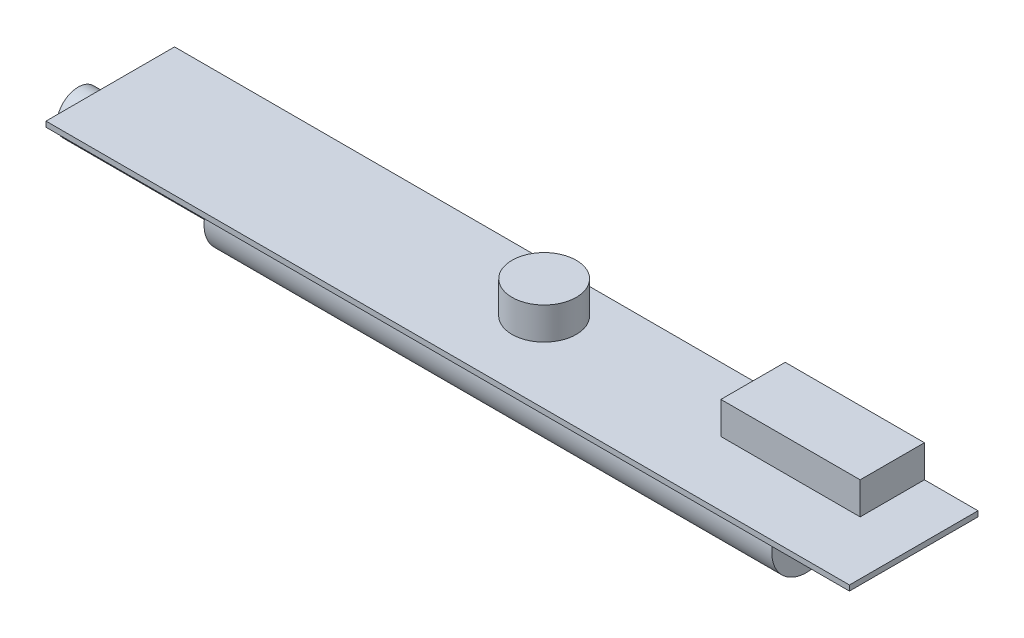
ISO-10303-21;
HEADER;
FILE_DESCRIPTION(('STEP AP214'),'2;1');
FILE_NAME('part.step','',(''),(''),'','','');
FILE_SCHEMA(('AUTOMOTIVE_DESIGN { 1 0 10303 214 1 1 1 1 }'));
ENDSEC;
DATA;
#1=APPLICATION_CONTEXT('core data for automotive mechanical design processes');
#2=APPLICATION_PROTOCOL_DEFINITION('international standard','automotive_design',2000,#1);
#3=PRODUCT_CONTEXT('',#1,'mechanical');
#4=PRODUCT('Part','Part','',(#3));
#5=PRODUCT_RELATED_PRODUCT_CATEGORY('part','',(#4));
#6=PRODUCT_DEFINITION_FORMATION('','',#4);
#7=PRODUCT_DEFINITION_CONTEXT('part definition',#1,'design');
#8=PRODUCT_DEFINITION('design','',#6,#7);
#9=PRODUCT_DEFINITION_SHAPE('','',#8);
#10=(LENGTH_UNIT() NAMED_UNIT(*) SI_UNIT(.MILLI.,.METRE.));
#11=(NAMED_UNIT(*) PLANE_ANGLE_UNIT() SI_UNIT($,.RADIAN.));
#12=(NAMED_UNIT(*) SI_UNIT($,.STERADIAN.) SOLID_ANGLE_UNIT());
#13=UNCERTAINTY_MEASURE_WITH_UNIT(LENGTH_MEASURE(1.E-05),#10,'distance_accuracy_value','');
#14=(GEOMETRIC_REPRESENTATION_CONTEXT(3) GLOBAL_UNCERTAINTY_ASSIGNED_CONTEXT((#13)) GLOBAL_UNIT_ASSIGNED_CONTEXT((#10,
#11,#12)) REPRESENTATION_CONTEXT('',''));
#15=CARTESIAN_POINT('',(0.,0.,0.));
#16=DIRECTION('',(0.,0.,1.));
#17=DIRECTION('',(1.,0.,0.));
#18=AXIS2_PLACEMENT_3D('',#15,#16,#17);
#19=CARTESIAN_POINT('',(-25.5,-3.25,0.));
#20=DIRECTION('',(1.,0.,0.));
#21=DIRECTION('',(0.,0.,-1.));
#22=AXIS2_PLACEMENT_3D('',#19,#20,#21);
#23=CYLINDRICAL_SURFACE('',#22,3.25);
#24=CARTESIAN_POINT('',(-25.5,-3.25,0.));
#25=DIRECTION('',(1.,0.,0.));
#26=DIRECTION('',(0.,0.,-1.));
#27=AXIS2_PLACEMENT_3D('',#24,#25,#26);
#28=CIRCLE('',#27,3.25);
#29=CARTESIAN_POINT('',(-25.5,-3.25,-3.25));
#30=VERTEX_POINT('',#29);
#31=EDGE_CURVE('E52',#30,#30,#28,.T.);
#32=ORIENTED_EDGE('',*,*,#31,.T.);
#33=EDGE_LOOP('',(#32));
#34=FACE_BOUND('',#33,.T.);
#35=CARTESIAN_POINT('',(27.5,-3.25,0.));
#36=DIRECTION('',(1.,0.,0.));
#37=DIRECTION('',(0.,0.,-1.));
#38=AXIS2_PLACEMENT_3D('',#35,#36,#37);
#39=CIRCLE('',#38,3.25);
#40=CARTESIAN_POINT('',(27.5,-3.25,-3.25));
#41=VERTEX_POINT('',#40);
#42=EDGE_CURVE('E48',#41,#41,#39,.T.);
#43=ORIENTED_EDGE('',*,*,#42,.F.);
#44=EDGE_LOOP('',(#43));
#45=FACE_BOUND('',#44,.T.);
#46=ADVANCED_FACE('F45',(#34,#45),#23,.T.);
#47=CARTESIAN_POINT('',(-25.5,-3.25,0.));
#48=DIRECTION('',(1.,0.,0.));
#49=DIRECTION('',(0.,0.,-1.));
#50=AXIS2_PLACEMENT_3D('',#47,#48,#49);
#51=PLANE('',#50);
#52=CARTESIAN_POINT('',(-25.5,-3.25,0.));
#53=DIRECTION('',(-1.,0.,0.));
#54=DIRECTION('',(0.,0.,1.));
#55=AXIS2_PLACEMENT_3D('',#52,#53,#54);
#56=CIRCLE('',#55,2.);
#57=CARTESIAN_POINT('',(-25.5,-3.25,2.));
#58=VERTEX_POINT('',#57);
#59=EDGE_CURVE('E11',#58,#58,#56,.T.);
#60=ORIENTED_EDGE('',*,*,#59,.F.);
#61=EDGE_LOOP('',(#60));
#62=FACE_BOUND('',#61,.T.);
#63=ORIENTED_EDGE('',*,*,#31,.F.);
#64=EDGE_LOOP('',(#63));
#65=FACE_BOUND('',#64,.T.);
#66=ADVANCED_FACE('F68',(#62,#65),#51,.F.);
#67=CARTESIAN_POINT('',(27.5,-3.25,0.));
#68=DIRECTION('',(1.,0.,0.));
#69=DIRECTION('',(0.,0.,-1.));
#70=AXIS2_PLACEMENT_3D('',#67,#68,#69);
#71=PLANE('',#70);
#72=ORIENTED_EDGE('',*,*,#42,.T.);
#73=EDGE_LOOP('',(#72));
#74=FACE_BOUND('',#73,.T.);
#75=ADVANCED_FACE('F65',(#74),#71,.T.);
#76=CARTESIAN_POINT('',(-40.5,-3.25,0.));
#77=DIRECTION('',(1.,0.,0.));
#78=DIRECTION('',(0.,0.,-1.));
#79=AXIS2_PLACEMENT_3D('',#76,#77,#78);
#80=CYLINDRICAL_SURFACE('',#79,2.);
#81=CARTESIAN_POINT('',(-40.5,-3.25,0.));
#82=DIRECTION('',(-1.,0.,0.));
#83=DIRECTION('',(0.,0.,1.));
#84=AXIS2_PLACEMENT_3D('',#81,#82,#83);
#85=CIRCLE('',#84,2.);
#86=CARTESIAN_POINT('',(-40.5,-3.25,2.));
#87=VERTEX_POINT('',#86);
#88=EDGE_CURVE('E58',#87,#87,#85,.T.);
#89=ORIENTED_EDGE('',*,*,#88,.F.);
#90=EDGE_LOOP('',(#89));
#91=FACE_BOUND('',#90,.T.);
#92=ORIENTED_EDGE('',*,*,#59,.T.);
#93=EDGE_LOOP('',(#92));
#94=FACE_BOUND('',#93,.T.);
#95=ADVANCED_FACE('F80',(#91,#94),#80,.T.);
#96=CARTESIAN_POINT('',(-40.5,-3.25,0.));
#97=DIRECTION('',(-1.,0.,0.));
#98=DIRECTION('',(0.,0.,1.));
#99=AXIS2_PLACEMENT_3D('',#96,#97,#98);
#100=PLANE('',#99);
#101=ORIENTED_EDGE('',*,*,#88,.T.);
#102=EDGE_LOOP('',(#101));
#103=FACE_BOUND('',#102,.T.);
#104=ADVANCED_FACE('F84',(#103),#100,.T.);
#105=CLOSED_SHELL('',(#46,#66,#75,#95,#104));
#106=MANIFOLD_SOLID_BREP('B2',#105);
#107=CARTESIAN_POINT('',(19.5,3.5,-6.));
#108=DIRECTION('',(1.,0.,0.));
#109=DIRECTION('',(0.,0.,-1.));
#110=AXIS2_PLACEMENT_3D('',#107,#108,#109);
#111=PLANE('',#110);
#112=DIRECTION('',(0.,0.,1.));
#113=VECTOR('',#112,1.);
#114=CARTESIAN_POINT('',(19.5,0.5,-6.));
#115=LINE('',#114,#113);
#116=CARTESIAN_POINT('',(19.5,0.5,-6.));
#117=VERTEX_POINT('',#116);
#118=CARTESIAN_POINT('',(19.5,0.5,0.));
#119=VERTEX_POINT('',#118);
#120=EDGE_CURVE('E186',#117,#119,#115,.T.);
#121=ORIENTED_EDGE('',*,*,#120,.T.);
#122=DIRECTION('',(0.,-1.,0.));
#123=VECTOR('',#122,1.);
#124=CARTESIAN_POINT('',(19.5,3.5,0.));
#125=LINE('',#124,#123);
#126=CARTESIAN_POINT('',(19.5,3.5,0.));
#127=VERTEX_POINT('',#126);
#128=EDGE_CURVE('E43',#127,#119,#125,.T.);
#129=ORIENTED_EDGE('',*,*,#128,.F.);
#130=DIRECTION('',(0.,0.,1.));
#131=VECTOR('',#130,1.);
#132=CARTESIAN_POINT('',(19.5,3.5,-6.));
#133=LINE('',#132,#131);
#134=CARTESIAN_POINT('',(19.5,3.5,-6.));
#135=VERTEX_POINT('',#134);
#136=EDGE_CURVE('E174',#135,#127,#133,.T.);
#137=ORIENTED_EDGE('',*,*,#136,.F.);
#138=DIRECTION('',(0.,-1.,0.));
#139=VECTOR('',#138,1.);
#140=CARTESIAN_POINT('',(19.5,3.5,-6.));
#141=LINE('',#140,#139);
#142=EDGE_CURVE('E182',#135,#117,#141,.T.);
#143=ORIENTED_EDGE('',*,*,#142,.T.);
#144=EDGE_LOOP('',(#121,#129,#137,#143));
#145=FACE_BOUND('',#144,.T.);
#146=ADVANCED_FACE('F123',(#145),#111,.F.);
#147=CARTESIAN_POINT('',(19.5,3.5,0.));
#148=DIRECTION('',(0.,0.,-1.));
#149=DIRECTION('',(-1.,0.,0.));
#150=AXIS2_PLACEMENT_3D('',#147,#148,#149);
#151=PLANE('',#150);
#152=DIRECTION('',(1.,0.,0.));
#153=VECTOR('',#152,1.);
#154=CARTESIAN_POINT('',(19.5,0.5,0.));
#155=LINE('',#154,#153);
#156=CARTESIAN_POINT('',(32.5,0.5,0.));
#157=VERTEX_POINT('',#156);
#158=EDGE_CURVE('E178',#119,#157,#155,.T.);
#159=ORIENTED_EDGE('',*,*,#158,.T.);
#160=DIRECTION('',(0.,-1.,0.));
#161=VECTOR('',#160,1.);
#162=CARTESIAN_POINT('',(32.5,3.5,0.));
#163=LINE('',#162,#161);
#164=CARTESIAN_POINT('',(32.5,3.5,0.));
#165=VERTEX_POINT('',#164);
#166=EDGE_CURVE('E131',#165,#157,#163,.T.);
#167=ORIENTED_EDGE('',*,*,#166,.F.);
#168=DIRECTION('',(1.,0.,0.));
#169=VECTOR('',#168,1.);
#170=CARTESIAN_POINT('',(19.5,3.5,0.));
#171=LINE('',#170,#169);
#172=EDGE_CURVE('E169',#127,#165,#171,.T.);
#173=ORIENTED_EDGE('',*,*,#172,.F.);
#174=ORIENTED_EDGE('',*,*,#128,.T.);
#175=EDGE_LOOP('',(#159,#167,#173,#174));
#176=FACE_BOUND('',#175,.T.);
#177=ADVANCED_FACE('F177',(#176),#151,.F.);
#178=CARTESIAN_POINT('',(32.5,3.5,-6.));
#179=DIRECTION('',(-1.,0.,0.));
#180=DIRECTION('',(0.,0.,1.));
#181=AXIS2_PLACEMENT_3D('',#178,#179,#180);
#182=PLANE('',#181);
#183=DIRECTION('',(0.,0.,-1.));
#184=VECTOR('',#183,1.);
#185=CARTESIAN_POINT('',(32.5,0.5,-6.));
#186=LINE('',#185,#184);
#187=CARTESIAN_POINT('',(32.5,0.5,-6.));
#188=VERTEX_POINT('',#187);
#189=EDGE_CURVE('E156',#157,#188,#186,.T.);
#190=ORIENTED_EDGE('',*,*,#189,.T.);
#191=DIRECTION('',(0.,-1.,0.));
#192=VECTOR('',#191,1.);
#193=CARTESIAN_POINT('',(32.5,3.5,-6.));
#194=LINE('',#193,#192);
#195=CARTESIAN_POINT('',(32.5,3.5,-6.));
#196=VERTEX_POINT('',#195);
#197=EDGE_CURVE('E179',#196,#188,#194,.T.);
#198=ORIENTED_EDGE('',*,*,#197,.F.);
#199=DIRECTION('',(0.,0.,-1.));
#200=VECTOR('',#199,1.);
#201=CARTESIAN_POINT('',(32.5,3.5,-6.));
#202=LINE('',#201,#200);
#203=EDGE_CURVE('E172',#165,#196,#202,.T.);
#204=ORIENTED_EDGE('',*,*,#203,.F.);
#205=ORIENTED_EDGE('',*,*,#166,.T.);
#206=EDGE_LOOP('',(#190,#198,#204,#205));
#207=FACE_BOUND('',#206,.T.);
#208=ADVANCED_FACE('F180',(#207),#182,.F.);
#209=CARTESIAN_POINT('',(19.5,3.5,-6.));
#210=DIRECTION('',(0.,0.,1.));
#211=DIRECTION('',(1.,0.,0.));
#212=AXIS2_PLACEMENT_3D('',#209,#210,#211);
#213=PLANE('',#212);
#214=DIRECTION('',(-1.,0.,0.));
#215=VECTOR('',#214,1.);
#216=CARTESIAN_POINT('',(19.5,0.5,-6.));
#217=LINE('',#216,#215);
#218=EDGE_CURVE('E162',#188,#117,#217,.T.);
#219=ORIENTED_EDGE('',*,*,#218,.T.);
#220=ORIENTED_EDGE('',*,*,#142,.F.);
#221=DIRECTION('',(-1.,0.,0.));
#222=VECTOR('',#221,1.);
#223=CARTESIAN_POINT('',(19.5,3.5,-6.));
#224=LINE('',#223,#222);
#225=EDGE_CURVE('E139',#196,#135,#224,.T.);
#226=ORIENTED_EDGE('',*,*,#225,.F.);
#227=ORIENTED_EDGE('',*,*,#197,.T.);
#228=EDGE_LOOP('',(#219,#220,#226,#227));
#229=FACE_BOUND('',#228,.T.);
#230=ADVANCED_FACE('F193',(#229),#213,.F.);
#231=CARTESIAN_POINT('',(0.,3.5,0.));
#232=DIRECTION('',(0.,1.,0.));
#233=DIRECTION('',(0.,0.,1.));
#234=AXIS2_PLACEMENT_3D('',#231,#232,#233);
#235=PLANE('',#234);
#236=ORIENTED_EDGE('',*,*,#136,.T.);
#237=ORIENTED_EDGE('',*,*,#172,.T.);
#238=ORIENTED_EDGE('',*,*,#203,.T.);
#239=ORIENTED_EDGE('',*,*,#225,.T.);
#240=EDGE_LOOP('',(#236,#237,#238,#239));
#241=FACE_BOUND('',#240,.T.);
#242=ADVANCED_FACE('F170',(#241),#235,.T.);
#243=CARTESIAN_POINT('',(0.,0.5,0.));
#244=DIRECTION('',(0.,1.,0.));
#245=DIRECTION('',(0.,0.,1.));
#246=AXIS2_PLACEMENT_3D('',#243,#244,#245);
#247=PLANE('',#246);
#248=ORIENTED_EDGE('',*,*,#120,.F.);
#249=ORIENTED_EDGE('',*,*,#218,.F.);
#250=ORIENTED_EDGE('',*,*,#189,.F.);
#251=ORIENTED_EDGE('',*,*,#158,.F.);
#252=EDGE_LOOP('',(#248,#249,#250,#251));
#253=FACE_BOUND('',#252,.T.);
#254=ADVANCED_FACE('F196',(#253),#247,.F.);
#255=CLOSED_SHELL('',(#146,#177,#208,#230,#242,#254));
#256=MANIFOLD_SOLID_BREP('B6',#255);
#257=CARTESIAN_POINT('',(1.5,3.5,-1.5));
#258=DIRECTION('',(0.,-1.,0.));
#259=DIRECTION('',(0.,0.,-1.));
#260=AXIS2_PLACEMENT_3D('',#257,#258,#259);
#261=CYLINDRICAL_SURFACE('',#260,3.);
#262=CARTESIAN_POINT('',(1.5,3.5,-1.5));
#263=DIRECTION('',(0.,1.,0.));
#264=DIRECTION('',(0.,0.,1.));
#265=AXIS2_PLACEMENT_3D('',#262,#263,#264);
#266=CIRCLE('',#265,3.);
#267=CARTESIAN_POINT('',(1.5,3.5,1.5));
#268=VERTEX_POINT('',#267);
#269=EDGE_CURVE('E122',#268,#268,#266,.T.);
#270=ORIENTED_EDGE('',*,*,#269,.F.);
#271=EDGE_LOOP('',(#270));
#272=FACE_BOUND('',#271,.T.);
#273=CARTESIAN_POINT('',(1.5,0.5,-1.5));
#274=DIRECTION('',(0.,1.,0.));
#275=DIRECTION('',(0.,0.,1.));
#276=AXIS2_PLACEMENT_3D('',#273,#274,#275);
#277=CIRCLE('',#276,3.);
#278=CARTESIAN_POINT('',(1.5,0.5,1.5));
#279=VERTEX_POINT('',#278);
#280=EDGE_CURVE('E260',#279,#279,#277,.T.);
#281=ORIENTED_EDGE('',*,*,#280,.T.);
#282=EDGE_LOOP('',(#281));
#283=FACE_BOUND('',#282,.T.);
#284=ADVANCED_FACE('F257',(#272,#283),#261,.T.);
#285=CARTESIAN_POINT('',(1.5,3.5,-1.5));
#286=DIRECTION('',(0.,1.,0.));
#287=DIRECTION('',(0.,0.,1.));
#288=AXIS2_PLACEMENT_3D('',#285,#286,#287);
#289=PLANE('',#288);
#290=ORIENTED_EDGE('',*,*,#269,.T.);
#291=EDGE_LOOP('',(#290));
#292=FACE_BOUND('',#291,.T.);
#293=ADVANCED_FACE('F272',(#292),#289,.T.);
#294=CARTESIAN_POINT('',(1.5,0.5,-1.5));
#295=DIRECTION('',(0.,1.,0.));
#296=DIRECTION('',(0.,0.,1.));
#297=AXIS2_PLACEMENT_3D('',#294,#295,#296);
#298=PLANE('',#297);
#299=ORIENTED_EDGE('',*,*,#280,.F.);
#300=EDGE_LOOP('',(#299));
#301=FACE_BOUND('',#300,.T.);
#302=ADVANCED_FACE('F270',(#301),#298,.F.);
#303=CLOSED_SHELL('',(#284,#293,#302));
#304=MANIFOLD_SOLID_BREP('B37',#303);
#305=CARTESIAN_POINT('',(37.5,0.5,-6.));
#306=DIRECTION('',(-1.,0.,0.));
#307=DIRECTION('',(0.,0.,1.));
#308=AXIS2_PLACEMENT_3D('',#305,#306,#307);
#309=PLANE('',#308);
#310=DIRECTION('',(0.,0.,-1.));
#311=VECTOR('',#310,1.);
#312=CARTESIAN_POINT('',(37.5,0.,-6.));
#313=LINE('',#312,#311);
#314=CARTESIAN_POINT('',(37.5,0.,6.));
#315=VERTEX_POINT('',#314);
#316=CARTESIAN_POINT('',(37.5,0.,-6.));
#317=VERTEX_POINT('',#316);
#318=EDGE_CURVE('E360',#315,#317,#313,.T.);
#319=ORIENTED_EDGE('',*,*,#318,.T.);
#320=DIRECTION('',(0.,-1.,0.));
#321=VECTOR('',#320,1.);
#322=CARTESIAN_POINT('',(37.5,0.5,-6.));
#323=LINE('',#322,#321);
#324=CARTESIAN_POINT('',(37.5,0.5,-6.));
#325=VERTEX_POINT('',#324);
#326=EDGE_CURVE('E255',#325,#317,#323,.T.);
#327=ORIENTED_EDGE('',*,*,#326,.F.);
#328=DIRECTION('',(0.,0.,-1.));
#329=VECTOR('',#328,1.);
#330=CARTESIAN_POINT('',(37.5,0.5,-6.));
#331=LINE('',#330,#329);
#332=CARTESIAN_POINT('',(37.5,0.5,6.));
#333=VERTEX_POINT('',#332);
#334=EDGE_CURVE('E348',#333,#325,#331,.T.);
#335=ORIENTED_EDGE('',*,*,#334,.F.);
#336=DIRECTION('',(0.,-1.,0.));
#337=VECTOR('',#336,1.);
#338=CARTESIAN_POINT('',(37.5,0.5,6.));
#339=LINE('',#338,#337);
#340=EDGE_CURVE('E356',#333,#315,#339,.T.);
#341=ORIENTED_EDGE('',*,*,#340,.T.);
#342=EDGE_LOOP('',(#319,#327,#335,#341));
#343=FACE_BOUND('',#342,.T.);
#344=ADVANCED_FACE('F297',(#343),#309,.F.);
#345=CARTESIAN_POINT('',(-37.5,0.5,-6.));
#346=DIRECTION('',(0.,0.,1.));
#347=DIRECTION('',(1.,0.,0.));
#348=AXIS2_PLACEMENT_3D('',#345,#346,#347);
#349=PLANE('',#348);
#350=DIRECTION('',(-1.,0.,0.));
#351=VECTOR('',#350,1.);
#352=CARTESIAN_POINT('',(-37.5,0.,-6.));
#353=LINE('',#352,#351);
#354=CARTESIAN_POINT('',(-37.5,0.,-6.));
#355=VERTEX_POINT('',#354);
#356=EDGE_CURVE('E352',#317,#355,#353,.T.);
#357=ORIENTED_EDGE('',*,*,#356,.T.);
#358=DIRECTION('',(0.,-1.,0.));
#359=VECTOR('',#358,1.);
#360=CARTESIAN_POINT('',(-37.5,0.5,-6.));
#361=LINE('',#360,#359);
#362=CARTESIAN_POINT('',(-37.5,0.5,-6.));
#363=VERTEX_POINT('',#362);
#364=EDGE_CURVE('E305',#363,#355,#361,.T.);
#365=ORIENTED_EDGE('',*,*,#364,.F.);
#366=DIRECTION('',(-1.,0.,0.));
#367=VECTOR('',#366,1.);
#368=CARTESIAN_POINT('',(-37.5,0.5,-6.));
#369=LINE('',#368,#367);
#370=EDGE_CURVE('E343',#325,#363,#369,.T.);
#371=ORIENTED_EDGE('',*,*,#370,.F.);
#372=ORIENTED_EDGE('',*,*,#326,.T.);
#373=EDGE_LOOP('',(#357,#365,#371,#372));
#374=FACE_BOUND('',#373,.T.);
#375=ADVANCED_FACE('F351',(#374),#349,.F.);
#376=CARTESIAN_POINT('',(-37.5,0.5,-6.));
#377=DIRECTION('',(1.,0.,0.));
#378=DIRECTION('',(0.,0.,-1.));
#379=AXIS2_PLACEMENT_3D('',#376,#377,#378);
#380=PLANE('',#379);
#381=DIRECTION('',(0.,0.,1.));
#382=VECTOR('',#381,1.);
#383=CARTESIAN_POINT('',(-37.5,0.,-6.));
#384=LINE('',#383,#382);
#385=CARTESIAN_POINT('',(-37.5,0.,6.));
#386=VERTEX_POINT('',#385);
#387=EDGE_CURVE('E330',#355,#386,#384,.T.);
#388=ORIENTED_EDGE('',*,*,#387,.T.);
#389=DIRECTION('',(0.,-1.,0.));
#390=VECTOR('',#389,1.);
#391=CARTESIAN_POINT('',(-37.5,0.5,6.));
#392=LINE('',#391,#390);
#393=CARTESIAN_POINT('',(-37.5,0.5,6.));
#394=VERTEX_POINT('',#393);
#395=EDGE_CURVE('E353',#394,#386,#392,.T.);
#396=ORIENTED_EDGE('',*,*,#395,.F.);
#397=DIRECTION('',(0.,0.,1.));
#398=VECTOR('',#397,1.);
#399=CARTESIAN_POINT('',(-37.5,0.5,-6.));
#400=LINE('',#399,#398);
#401=EDGE_CURVE('E346',#363,#394,#400,.T.);
#402=ORIENTED_EDGE('',*,*,#401,.F.);
#403=ORIENTED_EDGE('',*,*,#364,.T.);
#404=EDGE_LOOP('',(#388,#396,#402,#403));
#405=FACE_BOUND('',#404,.T.);
#406=ADVANCED_FACE('F354',(#405),#380,.F.);
#407=CARTESIAN_POINT('',(-37.5,0.5,6.));
#408=DIRECTION('',(0.,0.,-1.));
#409=DIRECTION('',(-1.,0.,0.));
#410=AXIS2_PLACEMENT_3D('',#407,#408,#409);
#411=PLANE('',#410);
#412=DIRECTION('',(1.,0.,0.));
#413=VECTOR('',#412,1.);
#414=CARTESIAN_POINT('',(-37.5,0.,6.));
#415=LINE('',#414,#413);
#416=EDGE_CURVE('E336',#386,#315,#415,.T.);
#417=ORIENTED_EDGE('',*,*,#416,.T.);
#418=ORIENTED_EDGE('',*,*,#340,.F.);
#419=DIRECTION('',(1.,0.,0.));
#420=VECTOR('',#419,1.);
#421=CARTESIAN_POINT('',(-37.5,0.5,6.));
#422=LINE('',#421,#420);
#423=EDGE_CURVE('E313',#394,#333,#422,.T.);
#424=ORIENTED_EDGE('',*,*,#423,.F.);
#425=ORIENTED_EDGE('',*,*,#395,.T.);
#426=EDGE_LOOP('',(#417,#418,#424,#425));
#427=FACE_BOUND('',#426,.T.);
#428=ADVANCED_FACE('F367',(#427),#411,.F.);
#429=CARTESIAN_POINT('',(0.,0.5,0.));
#430=DIRECTION('',(0.,1.,0.));
#431=DIRECTION('',(0.,0.,1.));
#432=AXIS2_PLACEMENT_3D('',#429,#430,#431);
#433=PLANE('',#432);
#434=ORIENTED_EDGE('',*,*,#334,.T.);
#435=ORIENTED_EDGE('',*,*,#370,.T.);
#436=ORIENTED_EDGE('',*,*,#401,.T.);
#437=ORIENTED_EDGE('',*,*,#423,.T.);
#438=EDGE_LOOP('',(#434,#435,#436,#437));
#439=FACE_BOUND('',#438,.T.);
#440=ADVANCED_FACE('F344',(#439),#433,.T.);
#441=CARTESIAN_POINT('',(0.,0.,0.));
#442=DIRECTION('',(0.,1.,0.));
#443=DIRECTION('',(0.,0.,1.));
#444=AXIS2_PLACEMENT_3D('',#441,#442,#443);
#445=PLANE('',#444);
#446=ORIENTED_EDGE('',*,*,#318,.F.);
#447=ORIENTED_EDGE('',*,*,#416,.F.);
#448=ORIENTED_EDGE('',*,*,#387,.F.);
#449=ORIENTED_EDGE('',*,*,#356,.F.);
#450=EDGE_LOOP('',(#446,#447,#448,#449));
#451=FACE_BOUND('',#450,.T.);
#452=ADVANCED_FACE('F370',(#451),#445,.F.);
#453=CLOSED_SHELL('',(#344,#375,#406,#428,#440,#452));
#454=MANIFOLD_SOLID_BREP('B117',#453);
#455=ADVANCED_BREP_SHAPE_REPRESENTATION('',(#18,#106,#256,#304,#454),#14);
#456=SHAPE_DEFINITION_REPRESENTATION(#9,#455);
ENDSEC;
END-ISO-10303-21;
